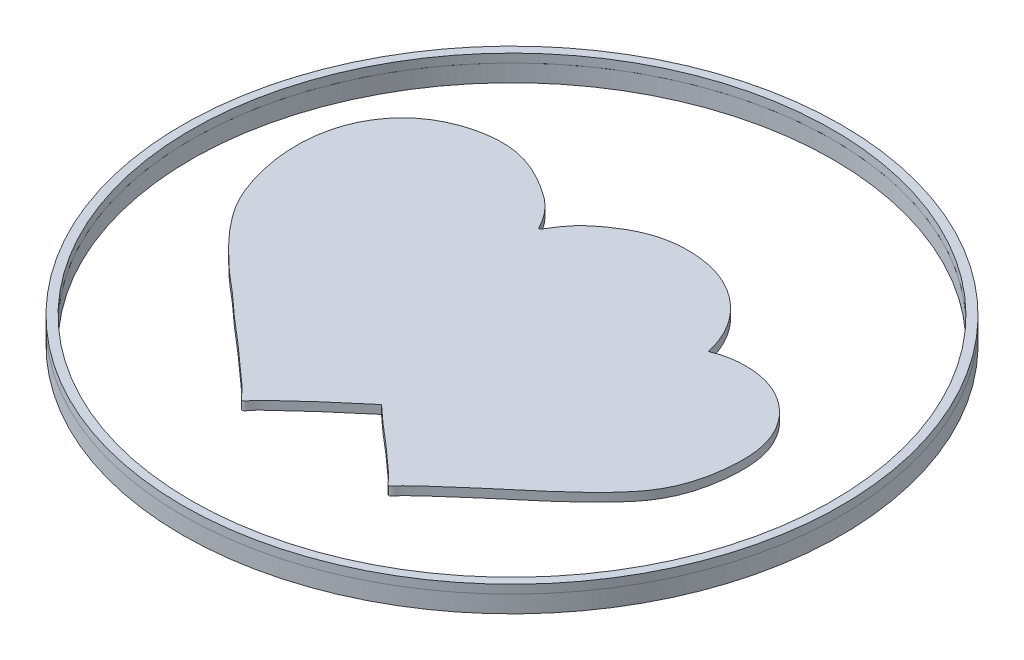
ISO-10303-21;
HEADER;
FILE_DESCRIPTION(('STEP AP214'),'2;1');
FILE_NAME('part.step','',(''),(''),'','','');
FILE_SCHEMA(('AUTOMOTIVE_DESIGN { 1 0 10303 214 1 1 1 1 }'));
ENDSEC;
DATA;
#1=APPLICATION_CONTEXT('core data for automotive mechanical design processes');
#2=APPLICATION_PROTOCOL_DEFINITION('international standard','automotive_design',2000,#1);
#3=PRODUCT_CONTEXT('',#1,'mechanical');
#4=PRODUCT('Part','Part','',(#3));
#5=PRODUCT_RELATED_PRODUCT_CATEGORY('part','',(#4));
#6=PRODUCT_DEFINITION_FORMATION('','',#4);
#7=PRODUCT_DEFINITION_CONTEXT('part definition',#1,'design');
#8=PRODUCT_DEFINITION('design','',#6,#7);
#9=PRODUCT_DEFINITION_SHAPE('','',#8);
#10=(LENGTH_UNIT() NAMED_UNIT(*) SI_UNIT(.MILLI.,.METRE.));
#11=(NAMED_UNIT(*) PLANE_ANGLE_UNIT() SI_UNIT($,.RADIAN.));
#12=(NAMED_UNIT(*) SI_UNIT($,.STERADIAN.) SOLID_ANGLE_UNIT());
#13=UNCERTAINTY_MEASURE_WITH_UNIT(LENGTH_MEASURE(1.E-05),#10,'distance_accuracy_value','');
#14=(GEOMETRIC_REPRESENTATION_CONTEXT(3) GLOBAL_UNCERTAINTY_ASSIGNED_CONTEXT((#13)) GLOBAL_UNIT_ASSIGNED_CONTEXT((#10,
#11,#12)) REPRESENTATION_CONTEXT('',''));
#15=CARTESIAN_POINT('',(0.,0.,0.));
#16=DIRECTION('',(0.,0.,1.));
#17=DIRECTION('',(1.,0.,0.));
#18=AXIS2_PLACEMENT_3D('',#15,#16,#17);
#19=CARTESIAN_POINT('',(35.,0.,-20.));
#20=DIRECTION('',(0.,1.,0.));
#21=DIRECTION('',(0.,0.,1.));
#22=AXIS2_PLACEMENT_3D('',#19,#20,#21);
#23=CYLINDRICAL_SURFACE('',#22,38.5);
#24=CARTESIAN_POINT('',(35.,0.,-20.));
#25=DIRECTION('',(0.,1.,0.));
#26=DIRECTION('',(0.,0.,1.));
#27=AXIS2_PLACEMENT_3D('',#24,#25,#26);
#28=CIRCLE('',#27,38.5);
#29=CARTESIAN_POINT('',(35.,0.,18.5));
#30=VERTEX_POINT('',#29);
#31=EDGE_CURVE('E12',#30,#30,#28,.T.);
#32=ORIENTED_EDGE('',*,*,#31,.T.);
#33=EDGE_LOOP('',(#32));
#34=FACE_BOUND('',#33,.T.);
#35=CARTESIAN_POINT('',(35.,1.,-20.));
#36=DIRECTION('',(0.,1.,0.));
#37=DIRECTION('',(0.,0.,1.));
#38=AXIS2_PLACEMENT_3D('',#35,#36,#37);
#39=CIRCLE('',#38,38.5);
#40=CARTESIAN_POINT('',(35.,1.,18.5));
#41=VERTEX_POINT('',#40);
#42=EDGE_CURVE('E61',#41,#41,#39,.T.);
#43=ORIENTED_EDGE('',*,*,#42,.F.);
#44=EDGE_LOOP('',(#43));
#45=FACE_BOUND('',#44,.T.);
#46=ADVANCED_FACE('F58',(#34,#45),#23,.T.);
#47=CARTESIAN_POINT('',(35.,0.,-20.));
#48=DIRECTION('',(0.,1.,0.));
#49=DIRECTION('',(0.,0.,1.));
#50=AXIS2_PLACEMENT_3D('',#47,#48,#49);
#51=PLANE('',#50);
#52=CARTESIAN_POINT('',(35.,0.,-20.));
#53=DIRECTION('',(0.,1.,0.));
#54=DIRECTION('',(0.,0.,1.));
#55=AXIS2_PLACEMENT_3D('',#52,#53,#54);
#56=CIRCLE('',#55,37.5);
#57=CARTESIAN_POINT('',(35.,0.,17.5));
#58=VERTEX_POINT('',#57);
#59=EDGE_CURVE('E68',#58,#58,#56,.T.);
#60=ORIENTED_EDGE('',*,*,#59,.T.);
#61=EDGE_LOOP('',(#60));
#62=FACE_BOUND('',#61,.T.);
#63=ORIENTED_EDGE('',*,*,#31,.F.);
#64=EDGE_LOOP('',(#63));
#65=FACE_BOUND('',#64,.T.);
#66=ADVANCED_FACE('F76',(#62,#65),#51,.F.);
#67=CARTESIAN_POINT('',(35.,1.,-20.));
#68=DIRECTION('',(0.,1.,0.));
#69=DIRECTION('',(0.,0.,1.));
#70=AXIS2_PLACEMENT_3D('',#67,#68,#69);
#71=PLANE('',#70);
#72=CARTESIAN_POINT('',(35.,1.,-20.));
#73=DIRECTION('',(0.,1.,0.));
#74=DIRECTION('',(0.,0.,1.));
#75=AXIS2_PLACEMENT_3D('',#72,#73,#74);
#76=CIRCLE('',#75,37.5);
#77=CARTESIAN_POINT('',(35.,1.,17.5));
#78=VERTEX_POINT('',#77);
#79=EDGE_CURVE('E70',#78,#78,#76,.T.);
#80=ORIENTED_EDGE('',*,*,#79,.F.);
#81=EDGE_LOOP('',(#80));
#82=FACE_BOUND('',#81,.T.);
#83=ORIENTED_EDGE('',*,*,#42,.T.);
#84=EDGE_LOOP('',(#83));
#85=FACE_BOUND('',#84,.T.);
#86=ADVANCED_FACE('F82',(#82,#85),#71,.T.);
#87=CARTESIAN_POINT('',(35.,0.,-20.));
#88=DIRECTION('',(0.,1.,0.));
#89=DIRECTION('',(0.,0.,1.));
#90=AXIS2_PLACEMENT_3D('',#87,#88,#89);
#91=CYLINDRICAL_SURFACE('',#90,37.5);
#92=ORIENTED_EDGE('',*,*,#59,.F.);
#93=EDGE_LOOP('',(#92));
#94=FACE_BOUND('',#93,.T.);
#95=ORIENTED_EDGE('',*,*,#79,.T.);
#96=EDGE_LOOP('',(#95));
#97=FACE_BOUND('',#96,.T.);
#98=ADVANCED_FACE('F79',(#94,#97),#91,.F.);
#99=CLOSED_SHELL('',(#46,#66,#86,#98));
#100=MANIFOLD_SOLID_BREP('B2',#99);
#101=CARTESIAN_POINT('',(35.,-2.,-20.));
#102=DIRECTION('',(0.,-1.,0.));
#103=DIRECTION('',(0.,0.,-1.));
#104=AXIS2_PLACEMENT_3D('',#101,#102,#103);
#105=PLANE('',#104);
#106=CARTESIAN_POINT('',(35.,-2.,-20.));
#107=DIRECTION('',(0.,-1.,0.));
#108=DIRECTION('',(0.,0.,-1.));
#109=AXIS2_PLACEMENT_3D('',#106,#107,#108);
#110=CIRCLE('',#109,38.5);
#111=CARTESIAN_POINT('',(35.,-2.,-58.5));
#112=VERTEX_POINT('',#111);
#113=EDGE_CURVE('E57',#112,#112,#110,.T.);
#114=ORIENTED_EDGE('',*,*,#113,.T.);
#115=EDGE_LOOP('',(#114));
#116=FACE_BOUND('',#115,.T.);
#117=CARTESIAN_POINT('',(35.,-2.,-20.));
#118=DIRECTION('',(0.,-1.,0.));
#119=DIRECTION('',(0.,0.,-1.));
#120=AXIS2_PLACEMENT_3D('',#117,#118,#119);
#121=CIRCLE('',#120,37.5);
#122=CARTESIAN_POINT('',(35.,-2.,-57.5));
#123=VERTEX_POINT('',#122);
#124=EDGE_CURVE('E140',#123,#123,#121,.T.);
#125=ORIENTED_EDGE('',*,*,#124,.F.);
#126=EDGE_LOOP('',(#125));
#127=FACE_BOUND('',#126,.T.);
#128=ADVANCED_FACE('F129',(#116,#127),#105,.T.);
#129=CARTESIAN_POINT('',(35.,0.,-20.));
#130=DIRECTION('',(0.,-1.,0.));
#131=DIRECTION('',(0.,0.,-1.));
#132=AXIS2_PLACEMENT_3D('',#129,#130,#131);
#133=PLANE('',#132);
#134=CARTESIAN_POINT('',(35.,0.,-20.));
#135=DIRECTION('',(0.,-1.,0.));
#136=DIRECTION('',(0.,0.,-1.));
#137=AXIS2_PLACEMENT_3D('',#134,#135,#136);
#138=CIRCLE('',#137,38.5);
#139=CARTESIAN_POINT('',(35.,0.,-58.5));
#140=VERTEX_POINT('',#139);
#141=EDGE_CURVE('E133',#140,#140,#138,.T.);
#142=ORIENTED_EDGE('',*,*,#141,.F.);
#143=EDGE_LOOP('',(#142));
#144=FACE_BOUND('',#143,.T.);
#145=CARTESIAN_POINT('',(35.,0.,-20.));
#146=DIRECTION('',(0.,-1.,0.));
#147=DIRECTION('',(0.,0.,-1.));
#148=AXIS2_PLACEMENT_3D('',#145,#146,#147);
#149=CIRCLE('',#148,37.5);
#150=CARTESIAN_POINT('',(35.,0.,-57.5));
#151=VERTEX_POINT('',#150);
#152=EDGE_CURVE('E142',#151,#151,#149,.T.);
#153=ORIENTED_EDGE('',*,*,#152,.T.);
#154=EDGE_LOOP('',(#153));
#155=FACE_BOUND('',#154,.T.);
#156=ADVANCED_FACE('F152',(#144,#155),#133,.F.);
#157=CARTESIAN_POINT('',(35.,-2.,-20.));
#158=DIRECTION('',(0.,1.,0.));
#159=DIRECTION('',(0.,0.,1.));
#160=AXIS2_PLACEMENT_3D('',#157,#158,#159);
#161=CYLINDRICAL_SURFACE('',#160,38.5);
#162=ORIENTED_EDGE('',*,*,#113,.F.);
#163=EDGE_LOOP('',(#162));
#164=FACE_BOUND('',#163,.T.);
#165=ORIENTED_EDGE('',*,*,#141,.T.);
#166=EDGE_LOOP('',(#165));
#167=FACE_BOUND('',#166,.T.);
#168=ADVANCED_FACE('F131',(#164,#167),#161,.T.);
#169=CARTESIAN_POINT('',(35.,-2.,-20.));
#170=DIRECTION('',(0.,1.,0.));
#171=DIRECTION('',(0.,0.,1.));
#172=AXIS2_PLACEMENT_3D('',#169,#170,#171);
#173=CYLINDRICAL_SURFACE('',#172,37.5);
#174=ORIENTED_EDGE('',*,*,#124,.T.);
#175=EDGE_LOOP('',(#174));
#176=FACE_BOUND('',#175,.T.);
#177=ORIENTED_EDGE('',*,*,#152,.F.);
#178=EDGE_LOOP('',(#177));
#179=FACE_BOUND('',#178,.T.);
#180=ADVANCED_FACE('F148',(#176,#179),#173,.F.);
#181=CLOSED_SHELL('',(#128,#156,#168,#180));
#182=MANIFOLD_SOLID_BREP('B7',#181);
#183=CARTESIAN_POINT('',(5.23517549683987,1.,-24.4302334759468));
#184=CARTESIAN_POINT('',(5.21951832124756,1.,-26.0528364076683));
#185=CARTESIAN_POINT('',(5.66802823546612,1.,-29.5024186310887));
#186=CARTESIAN_POINT('',(8.72955755906884,1.,-34.5046107147506));
#187=CARTESIAN_POINT('',(13.9605451944229,1.,-36.9103438850811));
#188=CARTESIAN_POINT('',(19.5080662186859,1.,-37.0365394882689));
#189=CARTESIAN_POINT('',(24.2814383231077,1.,-34.4643380989699));
#190=CARTESIAN_POINT('',(26.6123769740174,1.,-32.5361562623085));
#191=CARTESIAN_POINT('',(27.8637207825324,1.,-30.1510475551658));
#192=CARTESIAN_POINT('',(29.0529692364906,1.,-32.2861539341918));
#193=CARTESIAN_POINT('',(30.5738411222437,1.,-33.8120918299407));
#194=CARTESIAN_POINT('',(33.4667430954046,1.,-35.6853597334818));
#195=CARTESIAN_POINT('',(36.0565227205499,1.,-36.6791611336509));
#196=CARTESIAN_POINT('',(39.1159056073099,1.,-36.9763723640165));
#197=CARTESIAN_POINT('',(43.509781417991,1.,-36.32013582128));
#198=CARTESIAN_POINT('',(47.9334628018839,1.,-33.3074717808989));
#199=CARTESIAN_POINT('',(50.384663058633,1.,-28.2893059694762));
#200=CARTESIAN_POINT('',(50.5827181713066,1.,-22.080086888938));
#201=CARTESIAN_POINT('',(49.0979191240825,1.,-15.7493937530249));
#202=CARTESIAN_POINT('',(44.4681551887721,1.,-10.3899653511638));
#203=CARTESIAN_POINT('',(38.4989145822987,1.,-4.97019392814744));
#204=CARTESIAN_POINT('',(32.8856567339143,1.,-0.456666536604358));
#205=CARTESIAN_POINT('',(29.435459997336,1.,2.82942151569924));
#206=CARTESIAN_POINT('',(28.5110660043006,1.,3.66801041582905));
#207=CARTESIAN_POINT('',(27.8983253901591,1.,4.62288569284957));
#208=CARTESIAN_POINT('',(26.6829052179596,1.,3.09533219018127));
#209=CARTESIAN_POINT('',(25.093648810514,1.,1.84602062552336));
#210=CARTESIAN_POINT('',(22.4160554042769,1.,-0.717710153325576));
#211=CARTESIAN_POINT('',(19.5574806933053,1.,-2.99476430504127));
#212=CARTESIAN_POINT('',(16.8911955590537,1.,-5.5738814948703));
#213=CARTESIAN_POINT('',(14.4138069041407,1.,-7.56293349353334));
#214=CARTESIAN_POINT('',(12.407817827078,1.,-9.46319866075644));
#215=CARTESIAN_POINT('',(10.6556502077612,1.,-11.2287926875997));
#216=CARTESIAN_POINT('',(8.98930749363821,1.,-13.1712535861042));
#217=CARTESIAN_POINT('',(7.40710587820084,1.,-15.4300951503621));
#218=CARTESIAN_POINT('',(5.85440220522397,1.,-19.2294297537816));
#219=CARTESIAN_POINT('',(5.25573965472673,1.,-22.2991043537824));
#220=CARTESIAN_POINT('',(5.23517549683987,1.,-24.4302334759468));
#221=B_SPLINE_CURVE_WITH_KNOTS('',3,(#183,#184,#185,#186,#187,#188,#189,#190,#191,#192,#193,
#194,#195,#196,#197,#198,#199,#200,#201,#202,#203,#204,#205,#206,#207,#208,#209,#210,#211,#212,
#213,#214,#215,#216,#217,#218,#219,#220),.UNSPECIFIED.,.T.,.F.,(4,1,1,1,1,1,1,1,1,1,1,1,1,1,1,1,
1,1,1,1,1,1,1,1,1,1,1,1,1,1,1,1,1,1,1,4),(0.,0.0346023458169832,0.0732311143192742,
0.120202401641418,0.150835561774164,0.190180847675301,0.227348413699211,0.230138449011441,
0.232668193791519,0.266920715706851,0.287053289620069,0.303468793854219,0.326329390117665,
0.35188627192637,0.397575241787978,0.434238607197998,0.467156147264338,0.529381631527663,
0.567588281553681,0.616606048203501,0.70353144797595,0.716153701586808,0.724764396332108,
0.729948319189865,0.734661524544497,0.757644439092624,0.780075230476298,0.811318396847025,
0.836746798342747,0.859223620014232,0.879344592910314,0.895880759749065,0.912466947877282,
0.93414649329394,0.954553227148717,1.),.UNSPECIFIED.);
#222=DIRECTION('',(0.,-1.,0.));
#223=VECTOR('',#222,1.);
#224=SURFACE_OF_LINEAR_EXTRUSION('',#221,#223);
#225=DIRECTION('',(0.,-1.,0.));
#226=VECTOR('',#225,1.);
#227=CARTESIAN_POINT('',(50.1419452512311,1.,-27.7949789813768));
#228=LINE('',#227,#226);
#229=CARTESIAN_POINT('',(50.141945251403,0.,-27.7949789805752));
#230=VERTEX_POINT('',#229);
#231=CARTESIAN_POINT('',(50.141945251403,1.,-27.7949789805752));
#232=VERTEX_POINT('',#231);
#233=EDGE_CURVE('E127',#230,#232,#228,.F.);
#234=ORIENTED_EDGE('',*,*,#233,.F.);
#235=CARTESIAN_POINT('',(5.23517549683987,0.,-24.4302334759468));
#236=CARTESIAN_POINT('',(5.21951832124756,0.,-26.0528364076683));
#237=CARTESIAN_POINT('',(5.66802823546612,0.,-29.5024186310887));
#238=CARTESIAN_POINT('',(8.72955755906884,0.,-34.5046107147506));
#239=CARTESIAN_POINT('',(13.9605451944229,0.,-36.9103438850811));
#240=CARTESIAN_POINT('',(19.5080662186859,0.,-37.0365394882689));
#241=CARTESIAN_POINT('',(24.2814383231077,0.,-34.4643380989699));
#242=CARTESIAN_POINT('',(26.6123769740174,0.,-32.5361562623085));
#243=CARTESIAN_POINT('',(27.8637207825324,0.,-30.1510475551658));
#244=CARTESIAN_POINT('',(29.0529692364906,0.,-32.2861539341918));
#245=CARTESIAN_POINT('',(30.5738411222437,0.,-33.8120918299407));
#246=CARTESIAN_POINT('',(33.4667430954046,0.,-35.6853597334818));
#247=CARTESIAN_POINT('',(36.0565227205499,0.,-36.6791611336509));
#248=CARTESIAN_POINT('',(39.1159056073099,0.,-36.9763723640165));
#249=CARTESIAN_POINT('',(43.509781417991,0.,-36.32013582128));
#250=CARTESIAN_POINT('',(47.9334628018839,0.,-33.3074717808989));
#251=CARTESIAN_POINT('',(50.384663058633,0.,-28.2893059694762));
#252=CARTESIAN_POINT('',(50.5827181713066,0.,-22.080086888938));
#253=CARTESIAN_POINT('',(49.0979191240825,0.,-15.7493937530249));
#254=CARTESIAN_POINT('',(44.4681551887721,0.,-10.3899653511638));
#255=CARTESIAN_POINT('',(38.4989145822987,0.,-4.97019392814744));
#256=CARTESIAN_POINT('',(32.8856567339143,0.,-0.456666536604358));
#257=CARTESIAN_POINT('',(29.435459997336,0.,2.82942151569924));
#258=CARTESIAN_POINT('',(28.5110660043006,0.,3.66801041582905));
#259=CARTESIAN_POINT('',(27.8983253901591,0.,4.62288569284957));
#260=CARTESIAN_POINT('',(26.6829052179596,0.,3.09533219018127));
#261=CARTESIAN_POINT('',(25.093648810514,0.,1.84602062552336));
#262=CARTESIAN_POINT('',(22.4160554042769,0.,-0.717710153325576));
#263=CARTESIAN_POINT('',(19.5574806933053,0.,-2.99476430504127));
#264=CARTESIAN_POINT('',(16.8911955590537,0.,-5.5738814948703));
#265=CARTESIAN_POINT('',(14.4138069041407,0.,-7.56293349353334));
#266=CARTESIAN_POINT('',(12.407817827078,0.,-9.46319866075644));
#267=CARTESIAN_POINT('',(10.6556502077612,0.,-11.2287926875997));
#268=CARTESIAN_POINT('',(8.98930749363821,0.,-13.1712535861042));
#269=CARTESIAN_POINT('',(7.40710587820084,0.,-15.4300951503621));
#270=CARTESIAN_POINT('',(5.85440220522397,0.,-19.2294297537816));
#271=CARTESIAN_POINT('',(5.25573965472673,0.,-22.2991043537824));
#272=CARTESIAN_POINT('',(5.23517549683987,0.,-24.4302334759468));
#273=B_SPLINE_CURVE_WITH_KNOTS('',3,(#235,#236,#237,#238,#239,#240,#241,#242,#243,#244,#245,
#246,#247,#248,#249,#250,#251,#252,#253,#254,#255,#256,#257,#258,#259,#260,#261,#262,#263,#264,
#265,#266,#267,#268,#269,#270,#271,#272),.UNSPECIFIED.,.T.,.F.,(4,1,1,1,1,1,1,1,1,1,1,1,1,1,1,1,
1,1,1,1,1,1,1,1,1,1,1,1,1,1,1,1,1,1,1,4),(0.,0.0346023458169832,0.0732311143192742,
0.120202401641418,0.150835561774164,0.190180847675301,0.227348413699211,0.230138449011441,
0.232668193791519,0.266920715706851,0.287053289620069,0.303468793854219,0.326329390117665,
0.35188627192637,0.397575241787978,0.434238607197998,0.467156147264338,0.529381631527663,
0.567588281553681,0.616606048203501,0.70353144797595,0.716153701586808,0.724764396332108,
0.729948319189865,0.734661524544497,0.757644439092624,0.780075230476298,0.811318396847025,
0.836746798342747,0.859223620014232,0.879344592910314,0.895880759749065,0.912466947877282,
0.93414649329394,0.954553227148717,1.),.UNSPECIFIED.);
#274=CARTESIAN_POINT('',(36.4191112043998,0.,-3.3356187242757));
#275=VERTEX_POINT('',#274);
#276=EDGE_CURVE('E217',#275,#230,#273,.T.);
#277=ORIENTED_EDGE('',*,*,#276,.F.);
#278=DIRECTION('',(0.,-1.,0.));
#279=VECTOR('',#278,1.);
#280=CARTESIAN_POINT('',(36.4191112043998,1.,-3.33561872427569));
#281=LINE('',#280,#279);
#282=CARTESIAN_POINT('',(36.4191112043998,1.,-3.3356187242757));
#283=VERTEX_POINT('',#282);
#284=EDGE_CURVE('E200',#283,#275,#281,.T.);
#285=ORIENTED_EDGE('',*,*,#284,.F.);
#286=EDGE_CURVE('E219',#283,#232,#221,.T.);
#287=ORIENTED_EDGE('',*,*,#286,.T.);
#288=EDGE_LOOP('',(#234,#277,#285,#287));
#289=FACE_BOUND('',#288,.T.);
#290=ADVANCED_FACE('F191',(#289),#224,.T.);
#291=CARTESIAN_POINT('',(49.6452969689302,0.,-18.8580100436894));
#292=DIRECTION('',(0.,1.,0.));
#293=DIRECTION('',(0.,0.,1.));
#294=AXIS2_PLACEMENT_3D('',#291,#292,#293);
#295=PLANE('',#294);
#296=ORIENTED_EDGE('',*,*,#276,.T.);
#297=CARTESIAN_POINT('',(26.9654395853882,0.,-18.5906307098709));
#298=CARTESIAN_POINT('',(26.9529138449144,0.,-19.8887130552481));
#299=CARTESIAN_POINT('',(27.3117217762892,0.,-22.6483788339844));
#300=CARTESIAN_POINT('',(29.7609452351714,0.,-26.650132500914));
#301=CARTESIAN_POINT('',(33.9457353434546,0.,-28.5747190371784));
#302=CARTESIAN_POINT('',(38.3837521628651,0.,-28.6756755197286));
#303=CARTESIAN_POINT('',(42.2024498464025,0.,-26.6179144082894));
#304=CARTESIAN_POINT('',(44.0672007671303,0.,-25.0753689389603));
#305=CARTESIAN_POINT('',(45.0682758139423,0.,-23.1672819732461));
#306=CARTESIAN_POINT('',(46.0196745771087,0.,-24.8753670764669));
#307=CARTESIAN_POINT('',(47.2363720857113,0.,-26.0961173930661));
#308=CARTESIAN_POINT('',(49.55069366424,0.,-27.5947317158989));
#309=CARTESIAN_POINT('',(51.6225173643562,0.,-28.3897728360342));
#310=CARTESIAN_POINT('',(54.0700236737643,0.,-28.6275418203267));
#311=CARTESIAN_POINT('',(57.5851243223091,0.,-28.1025525861375));
#312=CARTESIAN_POINT('',(61.1240694294235,0.,-25.6924213538326));
#313=CARTESIAN_POINT('',(63.0850296348228,0.,-21.6778887046944));
#314=CARTESIAN_POINT('',(63.2434737249616,0.,-16.7105134402639));
#315=CARTESIAN_POINT('',(62.0556344871823,0.,-11.6459589315334));
#316=CARTESIAN_POINT('',(58.3518233389341,0.,-7.35841621004448));
#317=CARTESIAN_POINT('',(53.5764308537553,0.,-3.02259907163142));
#318=CARTESIAN_POINT('',(49.0858245750477,0.,0.588222841603057));
#319=CARTESIAN_POINT('',(46.3256671857852,0.,3.21709328344593));
#320=CARTESIAN_POINT('',(45.5861519913568,0.,3.88796440354978));
#321=CARTESIAN_POINT('',(45.0959595000436,0.,4.65186462516619));
#322=CARTESIAN_POINT('',(44.123623362284,0.,3.42982182303156));
#323=CARTESIAN_POINT('',(42.8522182363276,0.,2.43037257130522));
#324=CARTESIAN_POINT('',(40.7101435113378,0.,0.379387948226076));
#325=CARTESIAN_POINT('',(38.4232837425605,0.,-1.44225537314648));
#326=CARTESIAN_POINT('',(36.2902556351592,0.,-3.50554912500971));
#327=CARTESIAN_POINT('',(34.3083447112289,0.,-5.09679072394014));
#328=CARTESIAN_POINT('',(32.7035534495787,0.,-6.61700285771861));
#329=CARTESIAN_POINT('',(31.3018193541253,0.,-8.02947807919325));
#330=CARTESIAN_POINT('',(29.9687451828269,0.,-9.58344679799681));
#331=CARTESIAN_POINT('',(28.702983890477,0.,-11.3905200494031));
#332=CARTESIAN_POINT('',(27.4608209520955,0.,-14.4299877321387));
#333=CARTESIAN_POINT('',(26.9818909116977,0.,-16.8857274121394));
#334=CARTESIAN_POINT('',(26.9654395853882,0.,-18.5906307098709));
#335=B_SPLINE_CURVE_WITH_KNOTS('',3,(#297,#298,#299,#300,#301,#302,#303,#304,#305,#306,#307,
#308,#309,#310,#311,#312,#313,#314,#315,#316,#317,#318,#319,#320,#321,#322,#323,#324,#325,#326,
#327,#328,#329,#330,#331,#332,#333,#334),.UNSPECIFIED.,.T.,.F.,(4,1,1,1,1,1,1,1,1,1,1,1,1,1,1,1,
1,1,1,1,1,1,1,1,1,1,1,1,1,1,1,1,1,1,1,4),(0.,0.0346023458169832,0.0732311143192742,
0.120202401641418,0.150835561774164,0.190180847675301,0.227348413699211,0.230138449011441,
0.232668193791519,0.266920715706851,0.287053289620069,0.303468793854219,0.326329390117665,
0.35188627192637,0.397575241787978,0.434238607197998,0.467156147264338,0.529381631527663,
0.567588281553681,0.616606048203501,0.70353144797595,0.716153701586808,0.724764396332108,
0.729948319189865,0.734661524544497,0.757644439092624,0.780075230476298,0.811318396847025,
0.836746798342747,0.859223620014232,0.879344592910314,0.895880759749065,0.912466947877282,
0.93414649329394,0.954553227148717,1.),.UNSPECIFIED.);
#336=EDGE_CURVE('E221',#230,#275,#335,.T.);
#337=ORIENTED_EDGE('',*,*,#336,.T.);
#338=EDGE_LOOP('',(#296,#337));
#339=FACE_BOUND('',#338,.T.);
#340=ADVANCED_FACE('F225',(#339),#295,.F.);
#341=CARTESIAN_POINT('',(49.6452969689302,1.,-18.8580100436894));
#342=DIRECTION('',(0.,1.,0.));
#343=DIRECTION('',(0.,0.,1.));
#344=AXIS2_PLACEMENT_3D('',#341,#342,#343);
#345=PLANE('',#344);
#346=ORIENTED_EDGE('',*,*,#286,.F.);
#347=CARTESIAN_POINT('',(26.9654395853882,1.,-18.5906307098709));
#348=CARTESIAN_POINT('',(26.9529138449144,1.,-19.8887130552481));
#349=CARTESIAN_POINT('',(27.3117217762892,1.,-22.6483788339844));
#350=CARTESIAN_POINT('',(29.7609452351714,1.,-26.650132500914));
#351=CARTESIAN_POINT('',(33.9457353434546,1.,-28.5747190371784));
#352=CARTESIAN_POINT('',(38.3837521628651,1.,-28.6756755197286));
#353=CARTESIAN_POINT('',(42.2024498464025,1.,-26.6179144082894));
#354=CARTESIAN_POINT('',(44.0672007671303,1.,-25.0753689389603));
#355=CARTESIAN_POINT('',(45.0682758139423,1.,-23.1672819732461));
#356=CARTESIAN_POINT('',(46.0196745771087,1.,-24.8753670764669));
#357=CARTESIAN_POINT('',(47.2363720857113,1.,-26.0961173930661));
#358=CARTESIAN_POINT('',(49.55069366424,1.,-27.5947317158989));
#359=CARTESIAN_POINT('',(51.6225173643562,1.,-28.3897728360342));
#360=CARTESIAN_POINT('',(54.0700236737643,1.,-28.6275418203267));
#361=CARTESIAN_POINT('',(57.5851243223091,1.,-28.1025525861375));
#362=CARTESIAN_POINT('',(61.1240694294235,1.,-25.6924213538326));
#363=CARTESIAN_POINT('',(63.0850296348228,1.,-21.6778887046944));
#364=CARTESIAN_POINT('',(63.2434737249616,1.,-16.7105134402639));
#365=CARTESIAN_POINT('',(62.0556344871823,1.,-11.6459589315334));
#366=CARTESIAN_POINT('',(58.3518233389341,1.,-7.35841621004448));
#367=CARTESIAN_POINT('',(53.5764308537553,1.,-3.02259907163142));
#368=CARTESIAN_POINT('',(49.0858245750477,1.,0.588222841603057));
#369=CARTESIAN_POINT('',(46.3256671857852,1.,3.21709328344593));
#370=CARTESIAN_POINT('',(45.5861519913568,1.,3.88796440354978));
#371=CARTESIAN_POINT('',(45.0959595000436,1.,4.65186462516619));
#372=CARTESIAN_POINT('',(44.123623362284,1.,3.42982182303156));
#373=CARTESIAN_POINT('',(42.8522182363276,1.,2.43037257130522));
#374=CARTESIAN_POINT('',(40.7101435113378,1.,0.379387948226076));
#375=CARTESIAN_POINT('',(38.4232837425605,1.,-1.44225537314648));
#376=CARTESIAN_POINT('',(36.2902556351592,1.,-3.50554912500971));
#377=CARTESIAN_POINT('',(34.3083447112289,1.,-5.09679072394014));
#378=CARTESIAN_POINT('',(32.7035534495787,1.,-6.61700285771861));
#379=CARTESIAN_POINT('',(31.3018193541253,1.,-8.02947807919325));
#380=CARTESIAN_POINT('',(29.9687451828269,1.,-9.58344679799681));
#381=CARTESIAN_POINT('',(28.702983890477,1.,-11.3905200494031));
#382=CARTESIAN_POINT('',(27.4608209520955,1.,-14.4299877321387));
#383=CARTESIAN_POINT('',(26.9818909116977,1.,-16.8857274121394));
#384=CARTESIAN_POINT('',(26.9654395853882,1.,-18.5906307098709));
#385=B_SPLINE_CURVE_WITH_KNOTS('',3,(#347,#348,#349,#350,#351,#352,#353,#354,#355,#356,#357,
#358,#359,#360,#361,#362,#363,#364,#365,#366,#367,#368,#369,#370,#371,#372,#373,#374,#375,#376,
#377,#378,#379,#380,#381,#382,#383,#384),.UNSPECIFIED.,.T.,.F.,(4,1,1,1,1,1,1,1,1,1,1,1,1,1,1,1,
1,1,1,1,1,1,1,1,1,1,1,1,1,1,1,1,1,1,1,4),(0.,0.0346023458169832,0.0732311143192742,
0.120202401641418,0.150835561774164,0.190180847675301,0.227348413699211,0.230138449011441,
0.232668193791519,0.266920715706851,0.287053289620069,0.303468793854219,0.326329390117665,
0.35188627192637,0.397575241787978,0.434238607197998,0.467156147264338,0.529381631527663,
0.567588281553681,0.616606048203501,0.70353144797595,0.716153701586808,0.724764396332108,
0.729948319189865,0.734661524544497,0.757644439092624,0.780075230476298,0.811318396847025,
0.836746798342747,0.859223620014232,0.879344592910314,0.895880759749065,0.912466947877282,
0.93414649329394,0.954553227148717,1.),.UNSPECIFIED.);
#386=EDGE_CURVE('E223',#232,#283,#385,.T.);
#387=ORIENTED_EDGE('',*,*,#386,.F.);
#388=EDGE_LOOP('',(#346,#387));
#389=FACE_BOUND('',#388,.T.);
#390=ADVANCED_FACE('F254',(#389),#345,.T.);
#391=DIRECTION('',(0.,-1.,0.));
#392=VECTOR('',#391,1.);
#393=SURFACE_OF_LINEAR_EXTRUSION('',#385,#392);
#394=ORIENTED_EDGE('',*,*,#336,.F.);
#395=ORIENTED_EDGE('',*,*,#233,.T.);
#396=ORIENTED_EDGE('',*,*,#386,.T.);
#397=ORIENTED_EDGE('',*,*,#284,.T.);
#398=EDGE_LOOP('',(#394,#395,#396,#397));
#399=FACE_BOUND('',#398,.T.);
#400=ADVANCED_FACE('F193',(#399),#393,.T.);
#401=CLOSED_SHELL('',(#290,#340,#390,#400));
#402=MANIFOLD_SOLID_BREP('B52',#401);
#403=ADVANCED_BREP_SHAPE_REPRESENTATION('',(#18,#100,#182,#402),#14);
#404=SHAPE_DEFINITION_REPRESENTATION(#9,#403);
ENDSEC;
END-ISO-10303-21;
